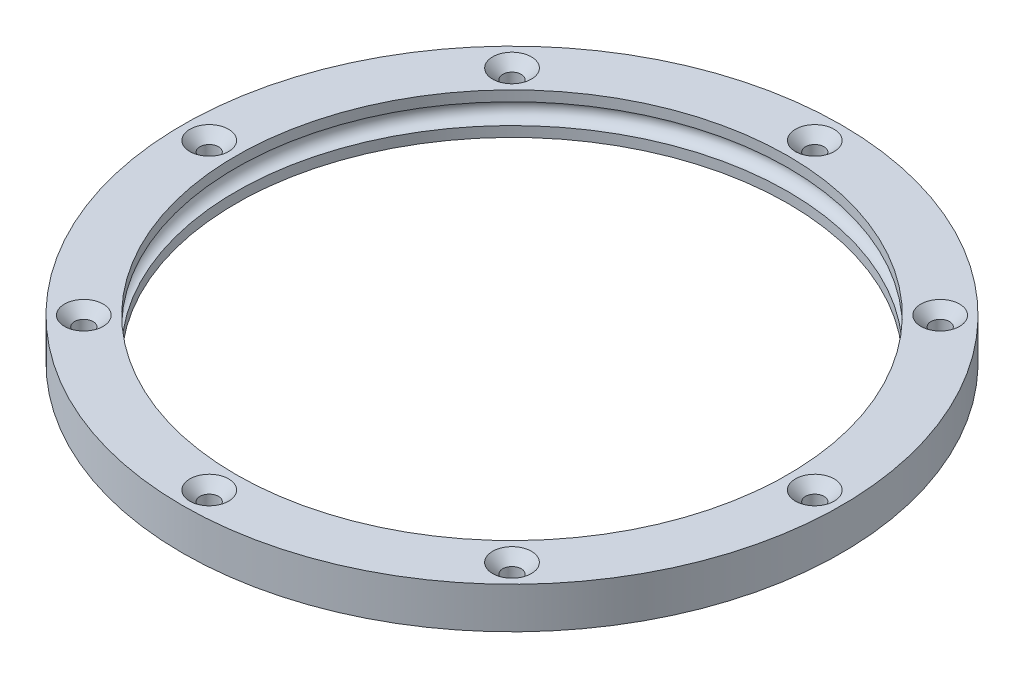
ISO-10303-21;
HEADER;
FILE_DESCRIPTION(('STEP AP214'),'2;1');
FILE_NAME('part.step','',(''),(''),'','','');
FILE_SCHEMA(('AUTOMOTIVE_DESIGN { 1 0 10303 214 1 1 1 1 }'));
ENDSEC;
DATA;
#1=APPLICATION_CONTEXT('core data for automotive mechanical design processes');
#2=APPLICATION_PROTOCOL_DEFINITION('international standard','automotive_design',2000,#1);
#3=PRODUCT_CONTEXT('',#1,'mechanical');
#4=PRODUCT('Part','Part','',(#3));
#5=PRODUCT_RELATED_PRODUCT_CATEGORY('part','',(#4));
#6=PRODUCT_DEFINITION_FORMATION('','',#4);
#7=PRODUCT_DEFINITION_CONTEXT('part definition',#1,'design');
#8=PRODUCT_DEFINITION('design','',#6,#7);
#9=PRODUCT_DEFINITION_SHAPE('','',#8);
#10=(LENGTH_UNIT() NAMED_UNIT(*) SI_UNIT(.MILLI.,.METRE.));
#11=(NAMED_UNIT(*) PLANE_ANGLE_UNIT() SI_UNIT($,.RADIAN.));
#12=(NAMED_UNIT(*) SI_UNIT($,.STERADIAN.) SOLID_ANGLE_UNIT());
#13=UNCERTAINTY_MEASURE_WITH_UNIT(LENGTH_MEASURE(1.E-05),#10,'distance_accuracy_value','');
#14=(GEOMETRIC_REPRESENTATION_CONTEXT(3) GLOBAL_UNCERTAINTY_ASSIGNED_CONTEXT((#13)) GLOBAL_UNIT_ASSIGNED_CONTEXT((#10,
#11,#12)) REPRESENTATION_CONTEXT('',''));
#15=CARTESIAN_POINT('',(0.,0.,0.));
#16=DIRECTION('',(0.,0.,1.));
#17=DIRECTION('',(1.,0.,0.));
#18=AXIS2_PLACEMENT_3D('',#15,#16,#17);
#19=CARTESIAN_POINT('',(0.,-5.61,0.));
#20=DIRECTION('',(0.,-1.,0.));
#21=DIRECTION('',(0.,0.,-1.));
#22=AXIS2_PLACEMENT_3D('',#19,#20,#21);
#23=CYLINDRICAL_SURFACE('',#22,80.);
#24=CARTESIAN_POINT('',(0.,-5.00000000000001,0.));
#25=DIRECTION('',(0.,-1.,0.));
#26=DIRECTION('',(0.,0.,-1.));
#27=AXIS2_PLACEMENT_3D('',#24,#25,#26);
#28=CIRCLE('',#27,80.);
#29=CARTESIAN_POINT('',(0.,-5.00000000000001,-80.));
#30=VERTEX_POINT('',#29);
#31=EDGE_CURVE('E10',#30,#30,#28,.T.);
#32=ORIENTED_EDGE('',*,*,#31,.F.);
#33=EDGE_LOOP('',(#32));
#34=FACE_BOUND('',#33,.T.);
#35=CARTESIAN_POINT('',(0.,4.99999999999999,0.));
#36=DIRECTION('',(0.,-1.,0.));
#37=DIRECTION('',(0.,0.,-1.));
#38=AXIS2_PLACEMENT_3D('',#35,#36,#37);
#39=CIRCLE('',#38,80.);
#40=CARTESIAN_POINT('',(0.,4.99999999999999,-80.));
#41=VERTEX_POINT('',#40);
#42=EDGE_CURVE('E59',#41,#41,#39,.T.);
#43=ORIENTED_EDGE('',*,*,#42,.T.);
#44=EDGE_LOOP('',(#43));
#45=FACE_BOUND('',#44,.T.);
#46=ADVANCED_FACE('F37',(#34,#45),#23,.T.);
#47=CARTESIAN_POINT('',(-67.,-5.00000000000001,0.));
#48=DIRECTION('',(0.,1.,0.));
#49=DIRECTION('',(0.,0.,1.));
#50=AXIS2_PLACEMENT_3D('',#47,#48,#49);
#51=PLANE('',#50);
#52=CARTESIAN_POINT('',(2.5662387840497E-13,-5.00000000000001,-73.5));
#53=DIRECTION('',(0.,1.,0.));
#54=DIRECTION('',(-1.,0.,0.));
#55=AXIS2_PLACEMENT_3D('',#52,#53,#54);
#56=CIRCLE('',#55,2.25);
#57=CARTESIAN_POINT('',(-2.24999999999975,-5.00000000000001,-73.5));
#58=VERTEX_POINT('',#57);
#59=EDGE_CURVE('E112',#58,#58,#56,.T.);
#60=ORIENTED_EDGE('',*,*,#59,.T.);
#61=EDGE_LOOP('',(#60));
#62=FACE_BOUND('',#61,.T.);
#63=CARTESIAN_POINT('',(51.9723484172115,-5.00000000000001,-51.972348417211));
#64=DIRECTION('',(0.,1.,0.));
#65=DIRECTION('',(-0.707106781186544,0.,-0.707106781186551));
#66=AXIS2_PLACEMENT_3D('',#63,#64,#65);
#67=CIRCLE('',#66,2.25);
#68=CARTESIAN_POINT('',(50.3813581595418,-5.00000000000001,-53.5633386748807));
#69=VERTEX_POINT('',#68);
#70=EDGE_CURVE('E105',#69,#69,#67,.T.);
#71=ORIENTED_EDGE('',*,*,#70,.T.);
#72=EDGE_LOOP('',(#71));
#73=FACE_BOUND('',#72,.T.);
#74=CARTESIAN_POINT('',(73.5,-5.00000000000001,0.));
#75=DIRECTION('',(0.,1.,0.));
#76=DIRECTION('',(0.,0.,-1.));
#77=AXIS2_PLACEMENT_3D('',#74,#75,#76);
#78=CIRCLE('',#77,2.25);
#79=CARTESIAN_POINT('',(73.5,-5.00000000000001,-2.25));
#80=VERTEX_POINT('',#79);
#81=EDGE_CURVE('E96',#80,#80,#78,.T.);
#82=ORIENTED_EDGE('',*,*,#81,.T.);
#83=EDGE_LOOP('',(#82));
#84=FACE_BOUND('',#83,.T.);
#85=CARTESIAN_POINT('',(51.9723484172108,-5.00000000000001,51.9723484172117));
#86=DIRECTION('',(0.,1.,0.));
#87=DIRECTION('',(0.707106781186554,0.,-0.707106781186541));
#88=AXIS2_PLACEMENT_3D('',#85,#86,#87);
#89=CIRCLE('',#88,2.25);
#90=CARTESIAN_POINT('',(53.5633386748805,-5.00000000000001,50.381358159542));
#91=VERTEX_POINT('',#90);
#92=EDGE_CURVE('E85',#91,#91,#89,.T.);
#93=ORIENTED_EDGE('',*,*,#92,.T.);
#94=EDGE_LOOP('',(#93));
#95=FACE_BOUND('',#94,.T.);
#96=CARTESIAN_POINT('',(-7.69871635214911E-13,-5.00000000000001,73.5));
#97=DIRECTION('',(0.,1.,0.));
#98=DIRECTION('',(1.,0.,0.));
#99=AXIS2_PLACEMENT_3D('',#96,#97,#98);
#100=CIRCLE('',#99,2.25);
#101=CARTESIAN_POINT('',(2.24999999999923,-5.00000000000001,73.5));
#102=VERTEX_POINT('',#101);
#103=EDGE_CURVE('E129',#102,#102,#100,.T.);
#104=ORIENTED_EDGE('',*,*,#103,.T.);
#105=EDGE_LOOP('',(#104));
#106=FACE_BOUND('',#105,.T.);
#107=CARTESIAN_POINT('',(-51.9723484172119,-5.00000000000001,51.9723484172106));
#108=DIRECTION('',(0.,1.,0.));
#109=DIRECTION('',(0.707106781186539,0.,0.707106781186556));
#110=AXIS2_PLACEMENT_3D('',#107,#108,#109);
#111=CIRCLE('',#110,2.25);
#112=CARTESIAN_POINT('',(-50.3813581595422,-5.00000000000001,53.5633386748804));
#113=VERTEX_POINT('',#112);
#114=EDGE_CURVE('E121',#113,#113,#111,.T.);
#115=ORIENTED_EDGE('',*,*,#114,.T.);
#116=EDGE_LOOP('',(#115));
#117=FACE_BOUND('',#116,.T.);
#118=CARTESIAN_POINT('',(-51.9723484172112,-5.00000000000001,-51.9723484172113));
#119=DIRECTION('',(0.,1.,0.));
#120=DIRECTION('',(-0.707106781186549,0.,0.707106781186546));
#121=AXIS2_PLACEMENT_3D('',#118,#119,#120);
#122=CIRCLE('',#121,2.25);
#123=CARTESIAN_POINT('',(-53.5633386748809,-5.00000000000001,-50.3813581595416));
#124=VERTEX_POINT('',#123);
#125=EDGE_CURVE('E74',#124,#124,#122,.T.);
#126=ORIENTED_EDGE('',*,*,#125,.T.);
#127=EDGE_LOOP('',(#126));
#128=FACE_BOUND('',#127,.T.);
#129=CARTESIAN_POINT('',(-73.5,-5.00000000000001,0.));
#130=DIRECTION('',(0.,1.,0.));
#131=DIRECTION('',(0.,0.,1.));
#132=AXIS2_PLACEMENT_3D('',#129,#130,#131);
#133=CIRCLE('',#132,2.25);
#134=CARTESIAN_POINT('',(-73.5,-5.00000000000001,2.25));
#135=VERTEX_POINT('',#134);
#136=EDGE_CURVE('E62',#135,#135,#133,.T.);
#137=ORIENTED_EDGE('',*,*,#136,.T.);
#138=EDGE_LOOP('',(#137));
#139=FACE_BOUND('',#138,.T.);
#140=CARTESIAN_POINT('',(0.,-5.00000000000001,0.));
#141=DIRECTION('',(0.,-1.,0.));
#142=DIRECTION('',(0.,0.,-1.));
#143=AXIS2_PLACEMENT_3D('',#140,#141,#142);
#144=CIRCLE('',#143,67.);
#145=CARTESIAN_POINT('',(0.,-5.00000000000001,-67.));
#146=VERTEX_POINT('',#145);
#147=EDGE_CURVE('E43',#146,#146,#144,.T.);
#148=ORIENTED_EDGE('',*,*,#147,.F.);
#149=EDGE_LOOP('',(#148));
#150=FACE_BOUND('',#149,.T.);
#151=ORIENTED_EDGE('',*,*,#31,.T.);
#152=EDGE_LOOP('',(#151));
#153=FACE_BOUND('',#152,.T.);
#154=ADVANCED_FACE('F167',(#62,#73,#84,#95,#106,#117,#128,#139,#150,#153),#51,.F.);
#155=CARTESIAN_POINT('',(0.,-5.61,0.));
#156=DIRECTION('',(0.,-1.,0.));
#157=DIRECTION('',(0.,0.,-1.));
#158=AXIS2_PLACEMENT_3D('',#155,#156,#157);
#159=CYLINDRICAL_SURFACE('',#158,67.);
#160=CARTESIAN_POINT('',(0.,-2.5,0.));
#161=DIRECTION('',(0.,-1.,0.));
#162=DIRECTION('',(0.,0.,-1.));
#163=AXIS2_PLACEMENT_3D('',#160,#161,#162);
#164=CIRCLE('',#163,67.);
#165=CARTESIAN_POINT('',(0.,-2.5,-67.));
#166=VERTEX_POINT('',#165);
#167=EDGE_CURVE('E47',#166,#166,#164,.T.);
#168=ORIENTED_EDGE('',*,*,#167,.F.);
#169=EDGE_LOOP('',(#168));
#170=FACE_BOUND('',#169,.T.);
#171=ORIENTED_EDGE('',*,*,#147,.T.);
#172=EDGE_LOOP('',(#171));
#173=FACE_BOUND('',#172,.T.);
#174=ADVANCED_FACE('F162',(#170,#173),#159,.F.);
#175=CARTESIAN_POINT('',(0.,0.,0.));
#176=DIRECTION('',(0.,-1.,0.));
#177=DIRECTION('',(0.,0.,-1.));
#178=AXIS2_PLACEMENT_3D('',#175,#176,#177);
#179=TOROIDAL_SURFACE('',#178,67.,2.5);
#180=CARTESIAN_POINT('',(0.,2.5,0.));
#181=DIRECTION('',(0.,-1.,0.));
#182=DIRECTION('',(0.,0.,-1.));
#183=AXIS2_PLACEMENT_3D('',#180,#181,#182);
#184=CIRCLE('',#183,67.);
#185=CARTESIAN_POINT('',(0.,2.5,-67.));
#186=VERTEX_POINT('',#185);
#187=EDGE_CURVE('E51',#186,#186,#184,.T.);
#188=ORIENTED_EDGE('',*,*,#187,.F.);
#189=EDGE_LOOP('',(#188));
#190=FACE_BOUND('',#189,.T.);
#191=ORIENTED_EDGE('',*,*,#167,.T.);
#192=EDGE_LOOP('',(#191));
#193=FACE_BOUND('',#192,.T.);
#194=ADVANCED_FACE('F156',(#190,#193),#179,.F.);
#195=CARTESIAN_POINT('',(0.,-5.61,0.));
#196=DIRECTION('',(0.,-1.,0.));
#197=DIRECTION('',(0.,0.,-1.));
#198=AXIS2_PLACEMENT_3D('',#195,#196,#197);
#199=CYLINDRICAL_SURFACE('',#198,67.);
#200=CARTESIAN_POINT('',(0.,4.99999999999999,0.));
#201=DIRECTION('',(0.,-1.,0.));
#202=DIRECTION('',(0.,0.,-1.));
#203=AXIS2_PLACEMENT_3D('',#200,#201,#202);
#204=CIRCLE('',#203,67.);
#205=CARTESIAN_POINT('',(0.,4.99999999999999,-67.));
#206=VERTEX_POINT('',#205);
#207=EDGE_CURVE('E56',#206,#206,#204,.T.);
#208=ORIENTED_EDGE('',*,*,#207,.F.);
#209=EDGE_LOOP('',(#208));
#210=FACE_BOUND('',#209,.T.);
#211=ORIENTED_EDGE('',*,*,#187,.T.);
#212=EDGE_LOOP('',(#211));
#213=FACE_BOUND('',#212,.T.);
#214=ADVANCED_FACE('F141',(#210,#213),#199,.F.);
#215=CARTESIAN_POINT('',(-67.,4.99999999999999,0.));
#216=DIRECTION('',(0.,-1.,0.));
#217=DIRECTION('',(0.,0.,-1.));
#218=AXIS2_PLACEMENT_3D('',#215,#216,#217);
#219=PLANE('',#218);
#220=CARTESIAN_POINT('',(2.5662387840497E-13,4.99999999999999,-73.5));
#221=DIRECTION('',(0.,1.,0.));
#222=DIRECTION('',(-1.,0.,0.));
#223=AXIS2_PLACEMENT_3D('',#220,#221,#222);
#224=CIRCLE('',#223,4.7);
#225=CARTESIAN_POINT('',(-4.69999999999974,4.99999999999999,-73.5));
#226=VERTEX_POINT('',#225);
#227=EDGE_CURVE('E104',#226,#226,#224,.T.);
#228=ORIENTED_EDGE('',*,*,#227,.F.);
#229=EDGE_LOOP('',(#228));
#230=FACE_BOUND('',#229,.T.);
#231=CARTESIAN_POINT('',(51.9723484172115,4.99999999999999,-51.972348417211));
#232=DIRECTION('',(0.,1.,0.));
#233=DIRECTION('',(-0.707106781186544,0.,-0.707106781186551));
#234=AXIS2_PLACEMENT_3D('',#231,#232,#233);
#235=CIRCLE('',#234,4.7);
#236=CARTESIAN_POINT('',(48.6489465456348,4.99999999999999,-55.2957502887878));
#237=VERTEX_POINT('',#236);
#238=EDGE_CURVE('E95',#237,#237,#235,.T.);
#239=ORIENTED_EDGE('',*,*,#238,.F.);
#240=EDGE_LOOP('',(#239));
#241=FACE_BOUND('',#240,.T.);
#242=CARTESIAN_POINT('',(73.5,4.99999999999999,0.));
#243=DIRECTION('',(0.,1.,0.));
#244=DIRECTION('',(0.,0.,-1.));
#245=AXIS2_PLACEMENT_3D('',#242,#243,#244);
#246=CIRCLE('',#245,4.7);
#247=CARTESIAN_POINT('',(73.5,4.99999999999999,-4.7));
#248=VERTEX_POINT('',#247);
#249=EDGE_CURVE('E84',#248,#248,#246,.T.);
#250=ORIENTED_EDGE('',*,*,#249,.F.);
#251=EDGE_LOOP('',(#250));
#252=FACE_BOUND('',#251,.T.);
#253=CARTESIAN_POINT('',(51.9723484172108,4.99999999999999,51.9723484172117));
#254=DIRECTION('',(0.,1.,0.));
#255=DIRECTION('',(0.707106781186554,0.,-0.707106781186541));
#256=AXIS2_PLACEMENT_3D('',#253,#254,#255);
#257=CIRCLE('',#256,4.7);
#258=CARTESIAN_POINT('',(55.2957502887876,4.99999999999999,48.6489465456349));
#259=VERTEX_POINT('',#258);
#260=EDGE_CURVE('E88',#259,#259,#257,.T.);
#261=ORIENTED_EDGE('',*,*,#260,.F.);
#262=EDGE_LOOP('',(#261));
#263=FACE_BOUND('',#262,.T.);
#264=CARTESIAN_POINT('',(-7.69871635214911E-13,4.99999999999999,73.5));
#265=DIRECTION('',(0.,1.,0.));
#266=DIRECTION('',(1.,0.,0.));
#267=AXIS2_PLACEMENT_3D('',#264,#265,#266);
#268=CIRCLE('',#267,4.7);
#269=CARTESIAN_POINT('',(4.69999999999923,4.99999999999999,73.5000000000001));
#270=VERTEX_POINT('',#269);
#271=EDGE_CURVE('E120',#270,#270,#268,.T.);
#272=ORIENTED_EDGE('',*,*,#271,.F.);
#273=EDGE_LOOP('',(#272));
#274=FACE_BOUND('',#273,.T.);
#275=CARTESIAN_POINT('',(-51.9723484172119,4.99999999999999,51.9723484172106));
#276=DIRECTION('',(0.,1.,0.));
#277=DIRECTION('',(0.707106781186539,0.,0.707106781186556));
#278=AXIS2_PLACEMENT_3D('',#275,#276,#277);
#279=CIRCLE('',#278,4.7);
#280=CARTESIAN_POINT('',(-48.6489465456351,4.99999999999999,55.2957502887874));
#281=VERTEX_POINT('',#280);
#282=EDGE_CURVE('E124',#281,#281,#279,.T.);
#283=ORIENTED_EDGE('',*,*,#282,.F.);
#284=EDGE_LOOP('',(#283));
#285=FACE_BOUND('',#284,.T.);
#286=CARTESIAN_POINT('',(-51.9723484172112,4.99999999999999,-51.9723484172113));
#287=DIRECTION('',(0.,1.,0.));
#288=DIRECTION('',(-0.707106781186549,0.,0.707106781186546));
#289=AXIS2_PLACEMENT_3D('',#286,#287,#288);
#290=CIRCLE('',#289,4.7);
#291=CARTESIAN_POINT('',(-55.2957502887879,4.99999999999999,-48.6489465456346));
#292=VERTEX_POINT('',#291);
#293=EDGE_CURVE('E77',#292,#292,#290,.T.);
#294=ORIENTED_EDGE('',*,*,#293,.F.);
#295=EDGE_LOOP('',(#294));
#296=FACE_BOUND('',#295,.T.);
#297=CARTESIAN_POINT('',(-73.5,4.99999999999999,0.));
#298=DIRECTION('',(0.,1.,0.));
#299=DIRECTION('',(0.,0.,1.));
#300=AXIS2_PLACEMENT_3D('',#297,#298,#299);
#301=CIRCLE('',#300,4.7);
#302=CARTESIAN_POINT('',(-73.5,4.99999999999999,4.7));
#303=VERTEX_POINT('',#302);
#304=EDGE_CURVE('E68',#303,#303,#301,.T.);
#305=ORIENTED_EDGE('',*,*,#304,.F.);
#306=EDGE_LOOP('',(#305));
#307=FACE_BOUND('',#306,.T.);
#308=ORIENTED_EDGE('',*,*,#42,.F.);
#309=EDGE_LOOP('',(#308));
#310=FACE_BOUND('',#309,.T.);
#311=ORIENTED_EDGE('',*,*,#207,.T.);
#312=EDGE_LOOP('',(#311));
#313=FACE_BOUND('',#312,.T.);
#314=ADVANCED_FACE('F137',(#230,#241,#252,#263,#274,#285,#296,#307,#310,#313),#219,.F.);
#315=CARTESIAN_POINT('',(-73.5,4.99999999999999,0.));
#316=DIRECTION('',(0.,1.,0.));
#317=DIRECTION('',(0.,0.,1.));
#318=AXIS2_PLACEMENT_3D('',#315,#316,#317);
#319=CYLINDRICAL_SURFACE('',#318,2.25);
#320=ORIENTED_EDGE('',*,*,#136,.F.);
#321=EDGE_LOOP('',(#320));
#322=FACE_BOUND('',#321,.T.);
#323=CARTESIAN_POINT('',(-73.5,2.54999999999999,0.));
#324=DIRECTION('',(0.,1.,0.));
#325=DIRECTION('',(0.,0.,1.));
#326=AXIS2_PLACEMENT_3D('',#323,#324,#325);
#327=CIRCLE('',#326,2.25);
#328=CARTESIAN_POINT('',(-73.5,2.54999999999999,2.25));
#329=VERTEX_POINT('',#328);
#330=EDGE_CURVE('E65',#329,#329,#327,.T.);
#331=ORIENTED_EDGE('',*,*,#330,.T.);
#332=EDGE_LOOP('',(#331));
#333=FACE_BOUND('',#332,.T.);
#334=ADVANCED_FACE('F140',(#322,#333),#319,.F.);
#335=CARTESIAN_POINT('',(-73.5,4.99999999999999,0.));
#336=DIRECTION('',(0.,1.,0.));
#337=DIRECTION('',(0.,0.,1.));
#338=AXIS2_PLACEMENT_3D('',#335,#336,#337);
#339=CONICAL_SURFACE('',#338,4.7,0.785398163397447);
#340=ORIENTED_EDGE('',*,*,#330,.F.);
#341=EDGE_LOOP('',(#340));
#342=FACE_BOUND('',#341,.T.);
#343=ORIENTED_EDGE('',*,*,#304,.T.);
#344=EDGE_LOOP('',(#343));
#345=FACE_BOUND('',#344,.T.);
#346=ADVANCED_FACE('F218',(#342,#345),#339,.F.);
#347=CARTESIAN_POINT('',(-51.9723484172112,4.99999999999999,-51.9723484172113));
#348=DIRECTION('',(0.,1.,0.));
#349=DIRECTION('',(-0.707106781186549,0.,0.707106781186546));
#350=AXIS2_PLACEMENT_3D('',#347,#348,#349);
#351=CYLINDRICAL_SURFACE('',#350,2.25);
#352=ORIENTED_EDGE('',*,*,#125,.F.);
#353=EDGE_LOOP('',(#352));
#354=FACE_BOUND('',#353,.T.);
#355=CARTESIAN_POINT('',(-51.9723484172112,2.54999999999999,-51.9723484172113));
#356=DIRECTION('',(0.,1.,0.));
#357=DIRECTION('',(-0.707106781186549,0.,0.707106781186546));
#358=AXIS2_PLACEMENT_3D('',#355,#356,#357);
#359=CIRCLE('',#358,2.25);
#360=CARTESIAN_POINT('',(-53.5633386748809,2.54999999999999,-50.3813581595416));
#361=VERTEX_POINT('',#360);
#362=EDGE_CURVE('E71',#361,#361,#359,.T.);
#363=ORIENTED_EDGE('',*,*,#362,.T.);
#364=EDGE_LOOP('',(#363));
#365=FACE_BOUND('',#364,.T.);
#366=ADVANCED_FACE('F227',(#354,#365),#351,.F.);
#367=CARTESIAN_POINT('',(-51.9723484172112,4.99999999999999,-51.9723484172113));
#368=DIRECTION('',(0.,1.,0.));
#369=DIRECTION('',(-0.707106781186549,0.,0.707106781186546));
#370=AXIS2_PLACEMENT_3D('',#367,#368,#369);
#371=CONICAL_SURFACE('',#370,4.7,0.785398163397447);
#372=ORIENTED_EDGE('',*,*,#362,.F.);
#373=EDGE_LOOP('',(#372));
#374=FACE_BOUND('',#373,.T.);
#375=ORIENTED_EDGE('',*,*,#293,.T.);
#376=EDGE_LOOP('',(#375));
#377=FACE_BOUND('',#376,.T.);
#378=ADVANCED_FACE('F237',(#374,#377),#371,.F.);
#379=CARTESIAN_POINT('',(-51.9723484172119,4.99999999999999,51.9723484172106));
#380=DIRECTION('',(0.,1.,0.));
#381=DIRECTION('',(0.707106781186539,0.,0.707106781186556));
#382=AXIS2_PLACEMENT_3D('',#379,#380,#381);
#383=CYLINDRICAL_SURFACE('',#382,2.25);
#384=ORIENTED_EDGE('',*,*,#114,.F.);
#385=EDGE_LOOP('',(#384));
#386=FACE_BOUND('',#385,.T.);
#387=CARTESIAN_POINT('',(-51.9723484172119,2.54999999999999,51.9723484172106));
#388=DIRECTION('',(0.,1.,0.));
#389=DIRECTION('',(0.707106781186539,0.,0.707106781186556));
#390=AXIS2_PLACEMENT_3D('',#387,#388,#389);
#391=CIRCLE('',#390,2.25);
#392=CARTESIAN_POINT('',(-50.3813581595422,2.54999999999999,53.5633386748804));
#393=VERTEX_POINT('',#392);
#394=EDGE_CURVE('E117',#393,#393,#391,.T.);
#395=ORIENTED_EDGE('',*,*,#394,.T.);
#396=EDGE_LOOP('',(#395));
#397=FACE_BOUND('',#396,.T.);
#398=ADVANCED_FACE('F248',(#386,#397),#383,.F.);
#399=CARTESIAN_POINT('',(-51.9723484172119,4.99999999999999,51.9723484172106));
#400=DIRECTION('',(0.,1.,0.));
#401=DIRECTION('',(0.707106781186539,0.,0.707106781186556));
#402=AXIS2_PLACEMENT_3D('',#399,#400,#401);
#403=CONICAL_SURFACE('',#402,4.7,0.785398163397447);
#404=ORIENTED_EDGE('',*,*,#394,.F.);
#405=EDGE_LOOP('',(#404));
#406=FACE_BOUND('',#405,.T.);
#407=ORIENTED_EDGE('',*,*,#282,.T.);
#408=EDGE_LOOP('',(#407));
#409=FACE_BOUND('',#408,.T.);
#410=ADVANCED_FACE('F258',(#406,#409),#403,.F.);
#411=CARTESIAN_POINT('',(-7.69871635214911E-13,4.99999999999999,73.5));
#412=DIRECTION('',(0.,1.,0.));
#413=DIRECTION('',(1.,0.,0.));
#414=AXIS2_PLACEMENT_3D('',#411,#412,#413);
#415=CYLINDRICAL_SURFACE('',#414,2.25);
#416=ORIENTED_EDGE('',*,*,#103,.F.);
#417=EDGE_LOOP('',(#416));
#418=FACE_BOUND('',#417,.T.);
#419=CARTESIAN_POINT('',(-7.69871635214911E-13,2.54999999999999,73.5));
#420=DIRECTION('',(0.,1.,0.));
#421=DIRECTION('',(1.,0.,0.));
#422=AXIS2_PLACEMENT_3D('',#419,#420,#421);
#423=CIRCLE('',#422,2.25);
#424=CARTESIAN_POINT('',(2.24999999999923,2.54999999999999,73.5));
#425=VERTEX_POINT('',#424);
#426=EDGE_CURVE('E91',#425,#425,#423,.T.);
#427=ORIENTED_EDGE('',*,*,#426,.T.);
#428=EDGE_LOOP('',(#427));
#429=FACE_BOUND('',#428,.T.);
#430=ADVANCED_FACE('F268',(#418,#429),#415,.F.);
#431=CARTESIAN_POINT('',(-7.69871635214911E-13,4.99999999999999,73.5));
#432=DIRECTION('',(0.,1.,0.));
#433=DIRECTION('',(1.,0.,0.));
#434=AXIS2_PLACEMENT_3D('',#431,#432,#433);
#435=CONICAL_SURFACE('',#434,4.7,0.785398163397447);
#436=ORIENTED_EDGE('',*,*,#426,.F.);
#437=EDGE_LOOP('',(#436));
#438=FACE_BOUND('',#437,.T.);
#439=ORIENTED_EDGE('',*,*,#271,.T.);
#440=EDGE_LOOP('',(#439));
#441=FACE_BOUND('',#440,.T.);
#442=ADVANCED_FACE('F135',(#438,#441),#435,.F.);
#443=CARTESIAN_POINT('',(51.9723484172108,4.99999999999999,51.9723484172117));
#444=DIRECTION('',(0.,1.,0.));
#445=DIRECTION('',(0.707106781186554,0.,-0.707106781186541));
#446=AXIS2_PLACEMENT_3D('',#443,#444,#445);
#447=CYLINDRICAL_SURFACE('',#446,2.25);
#448=ORIENTED_EDGE('',*,*,#92,.F.);
#449=EDGE_LOOP('',(#448));
#450=FACE_BOUND('',#449,.T.);
#451=CARTESIAN_POINT('',(51.9723484172108,2.54999999999999,51.9723484172117));
#452=DIRECTION('',(0.,1.,0.));
#453=DIRECTION('',(0.707106781186554,0.,-0.707106781186541));
#454=AXIS2_PLACEMENT_3D('',#451,#452,#453);
#455=CIRCLE('',#454,2.25);
#456=CARTESIAN_POINT('',(53.5633386748805,2.54999999999999,50.381358159542));
#457=VERTEX_POINT('',#456);
#458=EDGE_CURVE('E81',#457,#457,#455,.T.);
#459=ORIENTED_EDGE('',*,*,#458,.T.);
#460=EDGE_LOOP('',(#459));
#461=FACE_BOUND('',#460,.T.);
#462=ADVANCED_FACE('F287',(#450,#461),#447,.F.);
#463=CARTESIAN_POINT('',(51.9723484172108,4.99999999999999,51.9723484172117));
#464=DIRECTION('',(0.,1.,0.));
#465=DIRECTION('',(0.707106781186554,0.,-0.707106781186541));
#466=AXIS2_PLACEMENT_3D('',#463,#464,#465);
#467=CONICAL_SURFACE('',#466,4.7,0.785398163397447);
#468=ORIENTED_EDGE('',*,*,#458,.F.);
#469=EDGE_LOOP('',(#468));
#470=FACE_BOUND('',#469,.T.);
#471=ORIENTED_EDGE('',*,*,#260,.T.);
#472=EDGE_LOOP('',(#471));
#473=FACE_BOUND('',#472,.T.);
#474=ADVANCED_FACE('F297',(#470,#473),#467,.F.);
#475=CARTESIAN_POINT('',(73.5,4.99999999999999,0.));
#476=DIRECTION('',(0.,1.,0.));
#477=DIRECTION('',(0.,0.,-1.));
#478=AXIS2_PLACEMENT_3D('',#475,#476,#477);
#479=CYLINDRICAL_SURFACE('',#478,2.25);
#480=ORIENTED_EDGE('',*,*,#81,.F.);
#481=EDGE_LOOP('',(#480));
#482=FACE_BOUND('',#481,.T.);
#483=CARTESIAN_POINT('',(73.5,2.54999999999999,0.));
#484=DIRECTION('',(0.,1.,0.));
#485=DIRECTION('',(0.,0.,-1.));
#486=AXIS2_PLACEMENT_3D('',#483,#484,#485);
#487=CIRCLE('',#486,2.25);
#488=CARTESIAN_POINT('',(73.5,2.54999999999999,-2.25));
#489=VERTEX_POINT('',#488);
#490=EDGE_CURVE('E92',#489,#489,#487,.T.);
#491=ORIENTED_EDGE('',*,*,#490,.T.);
#492=EDGE_LOOP('',(#491));
#493=FACE_BOUND('',#492,.T.);
#494=ADVANCED_FACE('F307',(#482,#493),#479,.F.);
#495=CARTESIAN_POINT('',(73.5,4.99999999999999,0.));
#496=DIRECTION('',(0.,1.,0.));
#497=DIRECTION('',(0.,0.,-1.));
#498=AXIS2_PLACEMENT_3D('',#495,#496,#497);
#499=CONICAL_SURFACE('',#498,4.7,0.785398163397447);
#500=ORIENTED_EDGE('',*,*,#490,.F.);
#501=EDGE_LOOP('',(#500));
#502=FACE_BOUND('',#501,.T.);
#503=ORIENTED_EDGE('',*,*,#249,.T.);
#504=EDGE_LOOP('',(#503));
#505=FACE_BOUND('',#504,.T.);
#506=ADVANCED_FACE('F317',(#502,#505),#499,.F.);
#507=CARTESIAN_POINT('',(51.9723484172115,4.99999999999999,-51.972348417211));
#508=DIRECTION('',(0.,1.,0.));
#509=DIRECTION('',(-0.707106781186544,0.,-0.707106781186551));
#510=AXIS2_PLACEMENT_3D('',#507,#508,#509);
#511=CYLINDRICAL_SURFACE('',#510,2.25);
#512=ORIENTED_EDGE('',*,*,#70,.F.);
#513=EDGE_LOOP('',(#512));
#514=FACE_BOUND('',#513,.T.);
#515=CARTESIAN_POINT('',(51.9723484172115,2.54999999999999,-51.972348417211));
#516=DIRECTION('',(0.,1.,0.));
#517=DIRECTION('',(-0.707106781186544,0.,-0.707106781186551));
#518=AXIS2_PLACEMENT_3D('',#515,#516,#517);
#519=CIRCLE('',#518,2.25);
#520=CARTESIAN_POINT('',(50.3813581595418,2.54999999999999,-53.5633386748807));
#521=VERTEX_POINT('',#520);
#522=EDGE_CURVE('E101',#521,#521,#519,.T.);
#523=ORIENTED_EDGE('',*,*,#522,.T.);
#524=EDGE_LOOP('',(#523));
#525=FACE_BOUND('',#524,.T.);
#526=ADVANCED_FACE('F327',(#514,#525),#511,.F.);
#527=CARTESIAN_POINT('',(51.9723484172115,4.99999999999999,-51.972348417211));
#528=DIRECTION('',(0.,1.,0.));
#529=DIRECTION('',(-0.707106781186544,0.,-0.707106781186551));
#530=AXIS2_PLACEMENT_3D('',#527,#528,#529);
#531=CONICAL_SURFACE('',#530,4.7,0.785398163397447);
#532=ORIENTED_EDGE('',*,*,#522,.F.);
#533=EDGE_LOOP('',(#532));
#534=FACE_BOUND('',#533,.T.);
#535=ORIENTED_EDGE('',*,*,#238,.T.);
#536=EDGE_LOOP('',(#535));
#537=FACE_BOUND('',#536,.T.);
#538=ADVANCED_FACE('F337',(#534,#537),#531,.F.);
#539=CARTESIAN_POINT('',(2.5662387840497E-13,4.99999999999999,-73.5));
#540=DIRECTION('',(0.,1.,0.));
#541=DIRECTION('',(-1.,0.,0.));
#542=AXIS2_PLACEMENT_3D('',#539,#540,#541);
#543=CYLINDRICAL_SURFACE('',#542,2.25);
#544=ORIENTED_EDGE('',*,*,#59,.F.);
#545=EDGE_LOOP('',(#544));
#546=FACE_BOUND('',#545,.T.);
#547=CARTESIAN_POINT('',(2.5662387840497E-13,2.54999999999999,-73.5));
#548=DIRECTION('',(0.,1.,0.));
#549=DIRECTION('',(-1.,0.,0.));
#550=AXIS2_PLACEMENT_3D('',#547,#548,#549);
#551=CIRCLE('',#550,2.25);
#552=CARTESIAN_POINT('',(-2.24999999999975,2.54999999999999,-73.5));
#553=VERTEX_POINT('',#552);
#554=EDGE_CURVE('E80',#553,#553,#551,.T.);
#555=ORIENTED_EDGE('',*,*,#554,.T.);
#556=EDGE_LOOP('',(#555));
#557=FACE_BOUND('',#556,.T.);
#558=ADVANCED_FACE('F347',(#546,#557),#543,.F.);
#559=CARTESIAN_POINT('',(2.5662387840497E-13,4.99999999999999,-73.5));
#560=DIRECTION('',(0.,1.,0.));
#561=DIRECTION('',(-1.,0.,0.));
#562=AXIS2_PLACEMENT_3D('',#559,#560,#561);
#563=CONICAL_SURFACE('',#562,4.7,0.785398163397447);
#564=ORIENTED_EDGE('',*,*,#554,.F.);
#565=EDGE_LOOP('',(#564));
#566=FACE_BOUND('',#565,.T.);
#567=ORIENTED_EDGE('',*,*,#227,.T.);
#568=EDGE_LOOP('',(#567));
#569=FACE_BOUND('',#568,.T.);
#570=ADVANCED_FACE('F356',(#566,#569),#563,.F.);
#571=CLOSED_SHELL('',(#46,#154,#174,#194,#214,#314,#334,#346,#366,#378,#398,#410,#430,#442,#462,
#474,#494,#506,#526,#538,#558,#570));
#572=MANIFOLD_SOLID_BREP('B2',#571);
#573=ADVANCED_BREP_SHAPE_REPRESENTATION('',(#18,#572),#14);
#574=SHAPE_DEFINITION_REPRESENTATION(#9,#573);
ENDSEC;
END-ISO-10303-21;
